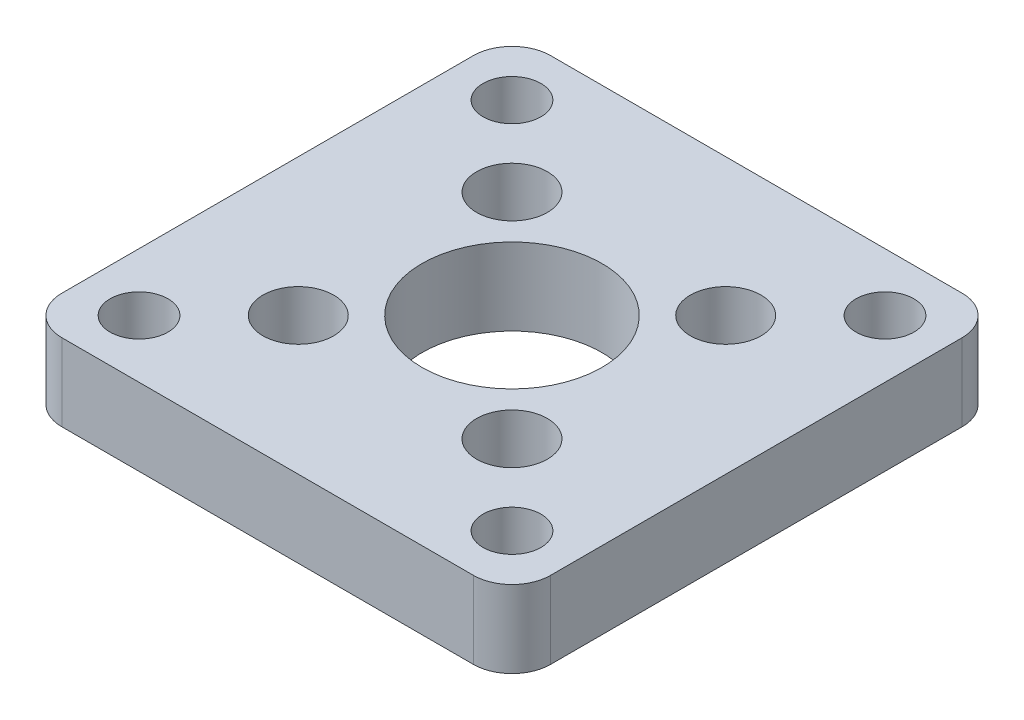
ISO-10303-21;
HEADER;
FILE_DESCRIPTION(('STEP AP214'),'2;1');
FILE_NAME('part.step','',(''),(''),'','','');
FILE_SCHEMA(('AUTOMOTIVE_DESIGN { 1 0 10303 214 1 1 1 1 }'));
ENDSEC;
DATA;
#1=APPLICATION_CONTEXT('core data for automotive mechanical design processes');
#2=APPLICATION_PROTOCOL_DEFINITION('international standard','automotive_design',2000,#1);
#3=PRODUCT_CONTEXT('',#1,'mechanical');
#4=PRODUCT('Part','Part','',(#3));
#5=PRODUCT_RELATED_PRODUCT_CATEGORY('part','',(#4));
#6=PRODUCT_DEFINITION_FORMATION('','',#4);
#7=PRODUCT_DEFINITION_CONTEXT('part definition',#1,'design');
#8=PRODUCT_DEFINITION('design','',#6,#7);
#9=PRODUCT_DEFINITION_SHAPE('','',#8);
#10=(LENGTH_UNIT() NAMED_UNIT(*) SI_UNIT(.MILLI.,.METRE.));
#11=(NAMED_UNIT(*) PLANE_ANGLE_UNIT() SI_UNIT($,.RADIAN.));
#12=(NAMED_UNIT(*) SI_UNIT($,.STERADIAN.) SOLID_ANGLE_UNIT());
#13=UNCERTAINTY_MEASURE_WITH_UNIT(LENGTH_MEASURE(1.E-05),#10,'distance_accuracy_value','');
#14=(GEOMETRIC_REPRESENTATION_CONTEXT(3) GLOBAL_UNCERTAINTY_ASSIGNED_CONTEXT((#13)) GLOBAL_UNIT_ASSIGNED_CONTEXT((#10,
#11,#12)) REPRESENTATION_CONTEXT('',''));
#15=CARTESIAN_POINT('',(0.,0.,0.));
#16=DIRECTION('',(0.,0.,1.));
#17=DIRECTION('',(1.,0.,0.));
#18=AXIS2_PLACEMENT_3D('',#15,#16,#17);
#19=CARTESIAN_POINT('',(-19.,3.,-19.));
#20=DIRECTION('',(1.,0.,0.));
#21=DIRECTION('',(0.,0.,-1.));
#22=AXIS2_PLACEMENT_3D('',#19,#20,#21);
#23=PLANE('',#22);
#24=DIRECTION('',(0.,0.,1.));
#25=VECTOR('',#24,1.);
#26=CARTESIAN_POINT('',(-19.,3.,-19.));
#27=LINE('',#26,#25);
#28=CARTESIAN_POINT('',(-19.,3.,-16.));
#29=VERTEX_POINT('',#28);
#30=CARTESIAN_POINT('',(-19.,3.,16.));
#31=VERTEX_POINT('',#30);
#32=EDGE_CURVE('E116',#29,#31,#27,.T.);
#33=ORIENTED_EDGE('',*,*,#32,.F.);
#34=DIRECTION('',(0.,-1.,0.));
#35=VECTOR('',#34,1.);
#36=CARTESIAN_POINT('',(-19.,3.,-16.));
#37=LINE('',#36,#35);
#38=CARTESIAN_POINT('',(-19.,-3.,-16.));
#39=VERTEX_POINT('',#38);
#40=EDGE_CURVE('E101',#29,#39,#37,.T.);
#41=ORIENTED_EDGE('',*,*,#40,.T.);
#42=DIRECTION('',(0.,0.,1.));
#43=VECTOR('',#42,1.);
#44=CARTESIAN_POINT('',(-19.,-3.,-19.));
#45=LINE('',#44,#43);
#46=CARTESIAN_POINT('',(-19.,-3.,16.));
#47=VERTEX_POINT('',#46);
#48=EDGE_CURVE('E113',#39,#47,#45,.T.);
#49=ORIENTED_EDGE('',*,*,#48,.T.);
#50=DIRECTION('',(0.,-1.,0.));
#51=VECTOR('',#50,1.);
#52=CARTESIAN_POINT('',(-19.,3.,16.));
#53=LINE('',#52,#51);
#54=EDGE_CURVE('E118',#47,#31,#53,.F.);
#55=ORIENTED_EDGE('',*,*,#54,.T.);
#56=EDGE_LOOP('',(#33,#41,#49,#55));
#57=FACE_BOUND('',#56,.T.);
#58=ADVANCED_FACE('F32',(#57),#23,.F.);
#59=CARTESIAN_POINT('',(-19.,3.,19.));
#60=DIRECTION('',(0.,0.,-1.));
#61=DIRECTION('',(-1.,0.,0.));
#62=AXIS2_PLACEMENT_3D('',#59,#60,#61);
#63=PLANE('',#62);
#64=DIRECTION('',(1.,0.,0.));
#65=VECTOR('',#64,1.);
#66=CARTESIAN_POINT('',(-19.,3.,19.));
#67=LINE('',#66,#65);
#68=CARTESIAN_POINT('',(-16.,3.,19.));
#69=VERTEX_POINT('',#68);
#70=CARTESIAN_POINT('',(16.,3.,19.));
#71=VERTEX_POINT('',#70);
#72=EDGE_CURVE('E171',#69,#71,#67,.T.);
#73=ORIENTED_EDGE('',*,*,#72,.F.);
#74=DIRECTION('',(0.,-1.,0.));
#75=VECTOR('',#74,1.);
#76=CARTESIAN_POINT('',(-16.,3.,19.));
#77=LINE('',#76,#75);
#78=CARTESIAN_POINT('',(-16.,-3.,19.));
#79=VERTEX_POINT('',#78);
#80=EDGE_CURVE('E155',#69,#79,#77,.T.);
#81=ORIENTED_EDGE('',*,*,#80,.T.);
#82=DIRECTION('',(1.,0.,0.));
#83=VECTOR('',#82,1.);
#84=CARTESIAN_POINT('',(-19.,-3.,19.));
#85=LINE('',#84,#83);
#86=CARTESIAN_POINT('',(16.,-3.,19.));
#87=VERTEX_POINT('',#86);
#88=EDGE_CURVE('E122',#79,#87,#85,.T.);
#89=ORIENTED_EDGE('',*,*,#88,.T.);
#90=DIRECTION('',(0.,-1.,0.));
#91=VECTOR('',#90,1.);
#92=CARTESIAN_POINT('',(16.,3.,19.));
#93=LINE('',#92,#91);
#94=EDGE_CURVE('E153',#87,#71,#93,.F.);
#95=ORIENTED_EDGE('',*,*,#94,.T.);
#96=EDGE_LOOP('',(#73,#81,#89,#95));
#97=FACE_BOUND('',#96,.T.);
#98=ADVANCED_FACE('F270',(#97),#63,.F.);
#99=CARTESIAN_POINT('',(19.,3.,-19.));
#100=DIRECTION('',(-1.,0.,0.));
#101=DIRECTION('',(0.,0.,1.));
#102=AXIS2_PLACEMENT_3D('',#99,#100,#101);
#103=PLANE('',#102);
#104=DIRECTION('',(0.,0.,-1.));
#105=VECTOR('',#104,1.);
#106=CARTESIAN_POINT('',(19.,-3.,-19.));
#107=LINE('',#106,#105);
#108=CARTESIAN_POINT('',(19.,-3.,16.));
#109=VERTEX_POINT('',#108);
#110=CARTESIAN_POINT('',(19.,-3.,-16.));
#111=VERTEX_POINT('',#110);
#112=EDGE_CURVE('E126',#109,#111,#107,.T.);
#113=ORIENTED_EDGE('',*,*,#112,.T.);
#114=DIRECTION('',(0.,-1.,0.));
#115=VECTOR('',#114,1.);
#116=CARTESIAN_POINT('',(19.,3.,-16.));
#117=LINE('',#116,#115);
#118=CARTESIAN_POINT('',(19.,3.,-16.));
#119=VERTEX_POINT('',#118);
#120=EDGE_CURVE('E11',#111,#119,#117,.F.);
#121=ORIENTED_EDGE('',*,*,#120,.T.);
#122=DIRECTION('',(0.,0.,-1.));
#123=VECTOR('',#122,1.);
#124=CARTESIAN_POINT('',(19.,3.,-19.));
#125=LINE('',#124,#123);
#126=CARTESIAN_POINT('',(19.,3.,16.));
#127=VERTEX_POINT('',#126);
#128=EDGE_CURVE('E161',#127,#119,#125,.T.);
#129=ORIENTED_EDGE('',*,*,#128,.F.);
#130=DIRECTION('',(0.,-1.,0.));
#131=VECTOR('',#130,1.);
#132=CARTESIAN_POINT('',(19.,3.,16.));
#133=LINE('',#132,#131);
#134=EDGE_CURVE('E40',#127,#109,#133,.T.);
#135=ORIENTED_EDGE('',*,*,#134,.T.);
#136=EDGE_LOOP('',(#113,#121,#129,#135));
#137=FACE_BOUND('',#136,.T.);
#138=ADVANCED_FACE('F160',(#137),#103,.F.);
#139=CARTESIAN_POINT('',(-19.,3.,-19.));
#140=DIRECTION('',(0.,0.,1.));
#141=DIRECTION('',(1.,0.,0.));
#142=AXIS2_PLACEMENT_3D('',#139,#140,#141);
#143=PLANE('',#142);
#144=DIRECTION('',(-1.,0.,0.));
#145=VECTOR('',#144,1.);
#146=CARTESIAN_POINT('',(-19.,-3.,-19.));
#147=LINE('',#146,#145);
#148=CARTESIAN_POINT('',(16.,-3.,-19.));
#149=VERTEX_POINT('',#148);
#150=CARTESIAN_POINT('',(-16.,-3.,-19.));
#151=VERTEX_POINT('',#150);
#152=EDGE_CURVE('E136',#149,#151,#147,.T.);
#153=ORIENTED_EDGE('',*,*,#152,.T.);
#154=DIRECTION('',(0.,-1.,0.));
#155=VECTOR('',#154,1.);
#156=CARTESIAN_POINT('',(-16.,3.,-19.));
#157=LINE('',#156,#155);
#158=CARTESIAN_POINT('',(-16.,3.,-19.));
#159=VERTEX_POINT('',#158);
#160=EDGE_CURVE('E102',#151,#159,#157,.F.);
#161=ORIENTED_EDGE('',*,*,#160,.T.);
#162=DIRECTION('',(-1.,0.,0.));
#163=VECTOR('',#162,1.);
#164=CARTESIAN_POINT('',(-19.,3.,-19.));
#165=LINE('',#164,#163);
#166=CARTESIAN_POINT('',(16.,3.,-19.));
#167=VERTEX_POINT('',#166);
#168=EDGE_CURVE('E132',#167,#159,#165,.T.);
#169=ORIENTED_EDGE('',*,*,#168,.F.);
#170=DIRECTION('',(0.,-1.,0.));
#171=VECTOR('',#170,1.);
#172=CARTESIAN_POINT('',(16.,3.,-19.));
#173=LINE('',#172,#171);
#174=EDGE_CURVE('E107',#167,#149,#173,.T.);
#175=ORIENTED_EDGE('',*,*,#174,.T.);
#176=EDGE_LOOP('',(#153,#161,#169,#175));
#177=FACE_BOUND('',#176,.T.);
#178=ADVANCED_FACE('F169',(#177),#143,.F.);
#179=CARTESIAN_POINT('',(-19.,3.,19.));
#180=DIRECTION('',(0.,1.,0.));
#181=DIRECTION('',(0.,0.,1.));
#182=AXIS2_PLACEMENT_3D('',#179,#180,#181);
#183=PLANE('',#182);
#184=CARTESIAN_POINT('',(0.,3.,0.));
#185=DIRECTION('',(0.,1.,0.));
#186=DIRECTION('',(0.,0.,1.));
#187=AXIS2_PLACEMENT_3D('',#184,#185,#186);
#188=CIRCLE('',#187,7.);
#189=CARTESIAN_POINT('',(0.,3.,7.));
#190=VERTEX_POINT('',#189);
#191=EDGE_CURVE('E220',#190,#190,#188,.T.);
#192=ORIENTED_EDGE('',*,*,#191,.F.);
#193=EDGE_LOOP('',(#192));
#194=FACE_BOUND('',#193,.T.);
#195=CARTESIAN_POINT('',(8.30850467894189,3.,-8.30850467894199));
#196=DIRECTION('',(0.,1.,0.));
#197=DIRECTION('',(0.,0.,-1.));
#198=AXIS2_PLACEMENT_3D('',#195,#196,#197);
#199=CIRCLE('',#198,2.75);
#200=CARTESIAN_POINT('',(8.30850467894189,3.,-11.058504678942));
#201=VERTEX_POINT('',#200);
#202=EDGE_CURVE('E214',#201,#201,#199,.T.);
#203=ORIENTED_EDGE('',*,*,#202,.F.);
#204=EDGE_LOOP('',(#203));
#205=FACE_BOUND('',#204,.T.);
#206=CARTESIAN_POINT('',(8.30850467894189,3.,8.30850467894198));
#207=DIRECTION('',(0.,1.,0.));
#208=DIRECTION('',(0.,0.,1.));
#209=AXIS2_PLACEMENT_3D('',#206,#207,#208);
#210=CIRCLE('',#209,2.75);
#211=CARTESIAN_POINT('',(8.30850467894189,3.,11.058504678942));
#212=VERTEX_POINT('',#211);
#213=EDGE_CURVE('E208',#212,#212,#210,.T.);
#214=ORIENTED_EDGE('',*,*,#213,.F.);
#215=EDGE_LOOP('',(#214));
#216=FACE_BOUND('',#215,.T.);
#217=CARTESIAN_POINT('',(-8.30850467894189,3.,8.30850467894198));
#218=DIRECTION('',(0.,1.,0.));
#219=DIRECTION('',(0.,0.,-1.));
#220=AXIS2_PLACEMENT_3D('',#217,#218,#219);
#221=CIRCLE('',#220,2.75);
#222=CARTESIAN_POINT('',(-8.30850467894189,3.,5.55850467894198));
#223=VERTEX_POINT('',#222);
#224=EDGE_CURVE('E202',#223,#223,#221,.T.);
#225=ORIENTED_EDGE('',*,*,#224,.F.);
#226=EDGE_LOOP('',(#225));
#227=FACE_BOUND('',#226,.T.);
#228=CARTESIAN_POINT('',(-8.30850467894189,3.,-8.30850467894198));
#229=DIRECTION('',(0.,1.,0.));
#230=DIRECTION('',(0.,0.,1.));
#231=AXIS2_PLACEMENT_3D('',#228,#229,#230);
#232=CIRCLE('',#231,2.75);
#233=CARTESIAN_POINT('',(-8.30850467894189,3.,-5.55850467894198));
#234=VERTEX_POINT('',#233);
#235=EDGE_CURVE('E196',#234,#234,#232,.T.);
#236=ORIENTED_EDGE('',*,*,#235,.F.);
#237=EDGE_LOOP('',(#236));
#238=FACE_BOUND('',#237,.T.);
#239=CARTESIAN_POINT('',(14.5,3.,-14.5));
#240=DIRECTION('',(0.,1.,0.));
#241=DIRECTION('',(0.,0.,-1.));
#242=AXIS2_PLACEMENT_3D('',#239,#240,#241);
#243=CIRCLE('',#242,2.25);
#244=CARTESIAN_POINT('',(14.5,3.,-16.75));
#245=VERTEX_POINT('',#244);
#246=EDGE_CURVE('E190',#245,#245,#243,.T.);
#247=ORIENTED_EDGE('',*,*,#246,.F.);
#248=EDGE_LOOP('',(#247));
#249=FACE_BOUND('',#248,.T.);
#250=CARTESIAN_POINT('',(14.5,3.,14.5));
#251=DIRECTION('',(0.,1.,0.));
#252=DIRECTION('',(0.,0.,1.));
#253=AXIS2_PLACEMENT_3D('',#250,#251,#252);
#254=CIRCLE('',#253,2.25);
#255=CARTESIAN_POINT('',(14.5,3.,16.75));
#256=VERTEX_POINT('',#255);
#257=EDGE_CURVE('E184',#256,#256,#254,.T.);
#258=ORIENTED_EDGE('',*,*,#257,.F.);
#259=EDGE_LOOP('',(#258));
#260=FACE_BOUND('',#259,.T.);
#261=CARTESIAN_POINT('',(-14.5,3.,14.5));
#262=DIRECTION('',(0.,1.,0.));
#263=DIRECTION('',(0.,0.,-1.));
#264=AXIS2_PLACEMENT_3D('',#261,#262,#263);
#265=CIRCLE('',#264,2.25);
#266=CARTESIAN_POINT('',(-14.5,3.,12.25));
#267=VERTEX_POINT('',#266);
#268=EDGE_CURVE('E178',#267,#267,#265,.T.);
#269=ORIENTED_EDGE('',*,*,#268,.F.);
#270=EDGE_LOOP('',(#269));
#271=FACE_BOUND('',#270,.T.);
#272=CARTESIAN_POINT('',(-14.5,3.,-14.5));
#273=DIRECTION('',(0.,1.,0.));
#274=DIRECTION('',(0.,0.,1.));
#275=AXIS2_PLACEMENT_3D('',#272,#273,#274);
#276=CIRCLE('',#275,2.25);
#277=CARTESIAN_POINT('',(-14.5,3.,-12.25));
#278=VERTEX_POINT('',#277);
#279=EDGE_CURVE('E129',#278,#278,#276,.T.);
#280=ORIENTED_EDGE('',*,*,#279,.F.);
#281=EDGE_LOOP('',(#280));
#282=FACE_BOUND('',#281,.T.);
#283=ORIENTED_EDGE('',*,*,#168,.T.);
#284=CARTESIAN_POINT('',(-16.,3.,-16.));
#285=DIRECTION('',(0.,1.,0.));
#286=DIRECTION('',(0.,0.,1.));
#287=AXIS2_PLACEMENT_3D('',#284,#285,#286);
#288=CIRCLE('',#287,3.);
#289=EDGE_CURVE('E151',#159,#29,#288,.T.);
#290=ORIENTED_EDGE('',*,*,#289,.T.);
#291=ORIENTED_EDGE('',*,*,#32,.T.);
#292=CARTESIAN_POINT('',(-16.,3.,16.));
#293=DIRECTION('',(0.,1.,0.));
#294=DIRECTION('',(0.,0.,1.));
#295=AXIS2_PLACEMENT_3D('',#292,#293,#294);
#296=CIRCLE('',#295,3.);
#297=EDGE_CURVE('E149',#31,#69,#296,.T.);
#298=ORIENTED_EDGE('',*,*,#297,.T.);
#299=ORIENTED_EDGE('',*,*,#72,.T.);
#300=CARTESIAN_POINT('',(16.,3.,16.));
#301=DIRECTION('',(0.,1.,0.));
#302=DIRECTION('',(0.,0.,1.));
#303=AXIS2_PLACEMENT_3D('',#300,#301,#302);
#304=CIRCLE('',#303,3.);
#305=EDGE_CURVE('E52',#71,#127,#304,.T.);
#306=ORIENTED_EDGE('',*,*,#305,.T.);
#307=ORIENTED_EDGE('',*,*,#128,.T.);
#308=CARTESIAN_POINT('',(16.,3.,-16.));
#309=DIRECTION('',(0.,1.,0.));
#310=DIRECTION('',(0.,0.,1.));
#311=AXIS2_PLACEMENT_3D('',#308,#309,#310);
#312=CIRCLE('',#311,3.);
#313=EDGE_CURVE('E147',#119,#167,#312,.T.);
#314=ORIENTED_EDGE('',*,*,#313,.T.);
#315=EDGE_LOOP('',(#283,#290,#291,#298,#299,#306,#307,#314));
#316=FACE_BOUND('',#315,.T.);
#317=ADVANCED_FACE('F235',(#194,#205,#216,#227,#238,#249,#260,#271,#282,#316),#183,.T.);
#318=CARTESIAN_POINT('',(-19.,-3.,19.));
#319=DIRECTION('',(0.,1.,0.));
#320=DIRECTION('',(0.,0.,1.));
#321=AXIS2_PLACEMENT_3D('',#318,#319,#320);
#322=PLANE('',#321);
#323=CARTESIAN_POINT('',(0.,-3.,0.));
#324=DIRECTION('',(0.,1.,0.));
#325=DIRECTION('',(0.,0.,1.));
#326=AXIS2_PLACEMENT_3D('',#323,#324,#325);
#327=CIRCLE('',#326,7.);
#328=CARTESIAN_POINT('',(0.,-3.,7.));
#329=VERTEX_POINT('',#328);
#330=EDGE_CURVE('E217',#329,#329,#327,.T.);
#331=ORIENTED_EDGE('',*,*,#330,.T.);
#332=EDGE_LOOP('',(#331));
#333=FACE_BOUND('',#332,.T.);
#334=CARTESIAN_POINT('',(8.30850467894189,-3.,-8.30850467894199));
#335=DIRECTION('',(0.,1.,0.));
#336=DIRECTION('',(0.,0.,-1.));
#337=AXIS2_PLACEMENT_3D('',#334,#335,#336);
#338=CIRCLE('',#337,2.75);
#339=CARTESIAN_POINT('',(8.30850467894189,-3.,-11.058504678942));
#340=VERTEX_POINT('',#339);
#341=EDGE_CURVE('E211',#340,#340,#338,.T.);
#342=ORIENTED_EDGE('',*,*,#341,.T.);
#343=EDGE_LOOP('',(#342));
#344=FACE_BOUND('',#343,.T.);
#345=CARTESIAN_POINT('',(8.30850467894189,-3.,8.30850467894198));
#346=DIRECTION('',(0.,1.,0.));
#347=DIRECTION('',(0.,0.,1.));
#348=AXIS2_PLACEMENT_3D('',#345,#346,#347);
#349=CIRCLE('',#348,2.75);
#350=CARTESIAN_POINT('',(8.30850467894189,-3.,11.058504678942));
#351=VERTEX_POINT('',#350);
#352=EDGE_CURVE('E205',#351,#351,#349,.T.);
#353=ORIENTED_EDGE('',*,*,#352,.T.);
#354=EDGE_LOOP('',(#353));
#355=FACE_BOUND('',#354,.T.);
#356=CARTESIAN_POINT('',(-8.30850467894189,-3.,8.30850467894198));
#357=DIRECTION('',(0.,1.,0.));
#358=DIRECTION('',(0.,0.,-1.));
#359=AXIS2_PLACEMENT_3D('',#356,#357,#358);
#360=CIRCLE('',#359,2.75);
#361=CARTESIAN_POINT('',(-8.30850467894189,-3.,5.55850467894198));
#362=VERTEX_POINT('',#361);
#363=EDGE_CURVE('E199',#362,#362,#360,.T.);
#364=ORIENTED_EDGE('',*,*,#363,.T.);
#365=EDGE_LOOP('',(#364));
#366=FACE_BOUND('',#365,.T.);
#367=CARTESIAN_POINT('',(-8.30850467894189,-3.,-8.30850467894198));
#368=DIRECTION('',(0.,1.,0.));
#369=DIRECTION('',(0.,0.,1.));
#370=AXIS2_PLACEMENT_3D('',#367,#368,#369);
#371=CIRCLE('',#370,2.75);
#372=CARTESIAN_POINT('',(-8.30850467894189,-3.,-5.55850467894198));
#373=VERTEX_POINT('',#372);
#374=EDGE_CURVE('E193',#373,#373,#371,.T.);
#375=ORIENTED_EDGE('',*,*,#374,.T.);
#376=EDGE_LOOP('',(#375));
#377=FACE_BOUND('',#376,.T.);
#378=CARTESIAN_POINT('',(14.5,-3.,-14.5));
#379=DIRECTION('',(0.,1.,0.));
#380=DIRECTION('',(0.,0.,-1.));
#381=AXIS2_PLACEMENT_3D('',#378,#379,#380);
#382=CIRCLE('',#381,2.25);
#383=CARTESIAN_POINT('',(14.5,-3.,-16.75));
#384=VERTEX_POINT('',#383);
#385=EDGE_CURVE('E187',#384,#384,#382,.T.);
#386=ORIENTED_EDGE('',*,*,#385,.T.);
#387=EDGE_LOOP('',(#386));
#388=FACE_BOUND('',#387,.T.);
#389=CARTESIAN_POINT('',(14.5,-3.,14.5));
#390=DIRECTION('',(0.,1.,0.));
#391=DIRECTION('',(0.,0.,1.));
#392=AXIS2_PLACEMENT_3D('',#389,#390,#391);
#393=CIRCLE('',#392,2.25);
#394=CARTESIAN_POINT('',(14.5,-3.,16.75));
#395=VERTEX_POINT('',#394);
#396=EDGE_CURVE('E181',#395,#395,#393,.T.);
#397=ORIENTED_EDGE('',*,*,#396,.T.);
#398=EDGE_LOOP('',(#397));
#399=FACE_BOUND('',#398,.T.);
#400=CARTESIAN_POINT('',(-14.5,-3.,14.5));
#401=DIRECTION('',(0.,1.,0.));
#402=DIRECTION('',(0.,0.,-1.));
#403=AXIS2_PLACEMENT_3D('',#400,#401,#402);
#404=CIRCLE('',#403,2.25);
#405=CARTESIAN_POINT('',(-14.5,-3.,12.25));
#406=VERTEX_POINT('',#405);
#407=EDGE_CURVE('E176',#406,#406,#404,.T.);
#408=ORIENTED_EDGE('',*,*,#407,.T.);
#409=EDGE_LOOP('',(#408));
#410=FACE_BOUND('',#409,.T.);
#411=CARTESIAN_POINT('',(-14.5,-3.,-14.5));
#412=DIRECTION('',(0.,1.,0.));
#413=DIRECTION('',(0.,0.,1.));
#414=AXIS2_PLACEMENT_3D('',#411,#412,#413);
#415=CIRCLE('',#414,2.25);
#416=CARTESIAN_POINT('',(-14.5,-3.,-12.25));
#417=VERTEX_POINT('',#416);
#418=EDGE_CURVE('E123',#417,#417,#415,.T.);
#419=ORIENTED_EDGE('',*,*,#418,.T.);
#420=EDGE_LOOP('',(#419));
#421=FACE_BOUND('',#420,.T.);
#422=ORIENTED_EDGE('',*,*,#48,.F.);
#423=CARTESIAN_POINT('',(-16.,-3.,-16.));
#424=DIRECTION('',(0.,1.,0.));
#425=DIRECTION('',(0.,0.,1.));
#426=AXIS2_PLACEMENT_3D('',#423,#424,#425);
#427=CIRCLE('',#426,3.);
#428=EDGE_CURVE('E97',#39,#151,#427,.F.);
#429=ORIENTED_EDGE('',*,*,#428,.T.);
#430=ORIENTED_EDGE('',*,*,#152,.F.);
#431=CARTESIAN_POINT('',(16.,-3.,-16.));
#432=DIRECTION('',(0.,1.,0.));
#433=DIRECTION('',(0.,0.,1.));
#434=AXIS2_PLACEMENT_3D('',#431,#432,#433);
#435=CIRCLE('',#434,3.);
#436=EDGE_CURVE('E140',#149,#111,#435,.F.);
#437=ORIENTED_EDGE('',*,*,#436,.T.);
#438=ORIENTED_EDGE('',*,*,#112,.F.);
#439=CARTESIAN_POINT('',(16.,-3.,16.));
#440=DIRECTION('',(0.,1.,0.));
#441=DIRECTION('',(0.,0.,1.));
#442=AXIS2_PLACEMENT_3D('',#439,#440,#441);
#443=CIRCLE('',#442,3.);
#444=EDGE_CURVE('E117',#109,#87,#443,.F.);
#445=ORIENTED_EDGE('',*,*,#444,.T.);
#446=ORIENTED_EDGE('',*,*,#88,.F.);
#447=CARTESIAN_POINT('',(-16.,-3.,16.));
#448=DIRECTION('',(0.,1.,0.));
#449=DIRECTION('',(0.,0.,1.));
#450=AXIS2_PLACEMENT_3D('',#447,#448,#449);
#451=CIRCLE('',#450,3.);
#452=EDGE_CURVE('E108',#79,#47,#451,.F.);
#453=ORIENTED_EDGE('',*,*,#452,.T.);
#454=EDGE_LOOP('',(#422,#429,#430,#437,#438,#445,#446,#453));
#455=FACE_BOUND('',#454,.T.);
#456=ADVANCED_FACE('F120',(#333,#344,#355,#366,#377,#388,#399,#410,#421,#455),#322,.F.);
#457=CARTESIAN_POINT('',(-14.5,-3.,-14.5));
#458=DIRECTION('',(0.,1.,0.));
#459=DIRECTION('',(0.,0.,1.));
#460=AXIS2_PLACEMENT_3D('',#457,#458,#459);
#461=CYLINDRICAL_SURFACE('',#460,2.25);
#462=ORIENTED_EDGE('',*,*,#418,.F.);
#463=EDGE_LOOP('',(#462));
#464=FACE_BOUND('',#463,.T.);
#465=ORIENTED_EDGE('',*,*,#279,.T.);
#466=EDGE_LOOP('',(#465));
#467=FACE_BOUND('',#466,.T.);
#468=ADVANCED_FACE('F255',(#464,#467),#461,.F.);
#469=CARTESIAN_POINT('',(-14.5,-3.,14.5));
#470=DIRECTION('',(0.,1.,0.));
#471=DIRECTION('',(0.,0.,1.));
#472=AXIS2_PLACEMENT_3D('',#469,#470,#471);
#473=CYLINDRICAL_SURFACE('',#472,2.25);
#474=ORIENTED_EDGE('',*,*,#407,.F.);
#475=EDGE_LOOP('',(#474));
#476=FACE_BOUND('',#475,.T.);
#477=ORIENTED_EDGE('',*,*,#268,.T.);
#478=EDGE_LOOP('',(#477));
#479=FACE_BOUND('',#478,.T.);
#480=ADVANCED_FACE('F257',(#476,#479),#473,.F.);
#481=CARTESIAN_POINT('',(14.5,-3.,14.5));
#482=DIRECTION('',(0.,1.,0.));
#483=DIRECTION('',(0.,0.,1.));
#484=AXIS2_PLACEMENT_3D('',#481,#482,#483);
#485=CYLINDRICAL_SURFACE('',#484,2.25);
#486=ORIENTED_EDGE('',*,*,#396,.F.);
#487=EDGE_LOOP('',(#486));
#488=FACE_BOUND('',#487,.T.);
#489=ORIENTED_EDGE('',*,*,#257,.T.);
#490=EDGE_LOOP('',(#489));
#491=FACE_BOUND('',#490,.T.);
#492=ADVANCED_FACE('F264',(#488,#491),#485,.F.);
#493=CARTESIAN_POINT('',(14.5,-3.,-14.5));
#494=DIRECTION('',(0.,1.,0.));
#495=DIRECTION('',(0.,0.,1.));
#496=AXIS2_PLACEMENT_3D('',#493,#494,#495);
#497=CYLINDRICAL_SURFACE('',#496,2.25);
#498=ORIENTED_EDGE('',*,*,#385,.F.);
#499=EDGE_LOOP('',(#498));
#500=FACE_BOUND('',#499,.T.);
#501=ORIENTED_EDGE('',*,*,#246,.T.);
#502=EDGE_LOOP('',(#501));
#503=FACE_BOUND('',#502,.T.);
#504=ADVANCED_FACE('F393',(#500,#503),#497,.F.);
#505=CARTESIAN_POINT('',(-8.30850467894189,-3.,-8.30850467894198));
#506=DIRECTION('',(0.,1.,0.));
#507=DIRECTION('',(0.,0.,1.));
#508=AXIS2_PLACEMENT_3D('',#505,#506,#507);
#509=CYLINDRICAL_SURFACE('',#508,2.75);
#510=ORIENTED_EDGE('',*,*,#374,.F.);
#511=EDGE_LOOP('',(#510));
#512=FACE_BOUND('',#511,.T.);
#513=ORIENTED_EDGE('',*,*,#235,.T.);
#514=EDGE_LOOP('',(#513));
#515=FACE_BOUND('',#514,.T.);
#516=ADVANCED_FACE('F383',(#512,#515),#509,.F.);
#517=CARTESIAN_POINT('',(-8.30850467894189,-3.,8.30850467894198));
#518=DIRECTION('',(0.,1.,0.));
#519=DIRECTION('',(0.,0.,1.));
#520=AXIS2_PLACEMENT_3D('',#517,#518,#519);
#521=CYLINDRICAL_SURFACE('',#520,2.75);
#522=ORIENTED_EDGE('',*,*,#363,.F.);
#523=EDGE_LOOP('',(#522));
#524=FACE_BOUND('',#523,.T.);
#525=ORIENTED_EDGE('',*,*,#224,.T.);
#526=EDGE_LOOP('',(#525));
#527=FACE_BOUND('',#526,.T.);
#528=ADVANCED_FACE('F373',(#524,#527),#521,.F.);
#529=CARTESIAN_POINT('',(8.30850467894189,-3.,8.30850467894198));
#530=DIRECTION('',(0.,1.,0.));
#531=DIRECTION('',(0.,0.,1.));
#532=AXIS2_PLACEMENT_3D('',#529,#530,#531);
#533=CYLINDRICAL_SURFACE('',#532,2.75);
#534=ORIENTED_EDGE('',*,*,#352,.F.);
#535=EDGE_LOOP('',(#534));
#536=FACE_BOUND('',#535,.T.);
#537=ORIENTED_EDGE('',*,*,#213,.T.);
#538=EDGE_LOOP('',(#537));
#539=FACE_BOUND('',#538,.T.);
#540=ADVANCED_FACE('F363',(#536,#539),#533,.F.);
#541=CARTESIAN_POINT('',(8.30850467894189,-3.,-8.30850467894199));
#542=DIRECTION('',(0.,1.,0.));
#543=DIRECTION('',(0.,0.,1.));
#544=AXIS2_PLACEMENT_3D('',#541,#542,#543);
#545=CYLINDRICAL_SURFACE('',#544,2.75);
#546=ORIENTED_EDGE('',*,*,#341,.F.);
#547=EDGE_LOOP('',(#546));
#548=FACE_BOUND('',#547,.T.);
#549=ORIENTED_EDGE('',*,*,#202,.T.);
#550=EDGE_LOOP('',(#549));
#551=FACE_BOUND('',#550,.T.);
#552=ADVANCED_FACE('F231',(#548,#551),#545,.F.);
#553=CARTESIAN_POINT('',(0.,-3.,0.));
#554=DIRECTION('',(0.,1.,0.));
#555=DIRECTION('',(0.,0.,1.));
#556=AXIS2_PLACEMENT_3D('',#553,#554,#555);
#557=CYLINDRICAL_SURFACE('',#556,7.);
#558=ORIENTED_EDGE('',*,*,#330,.F.);
#559=EDGE_LOOP('',(#558));
#560=FACE_BOUND('',#559,.T.);
#561=ORIENTED_EDGE('',*,*,#191,.T.);
#562=EDGE_LOOP('',(#561));
#563=FACE_BOUND('',#562,.T.);
#564=ADVANCED_FACE('F228',(#560,#563),#557,.F.);
#565=CARTESIAN_POINT('',(-16.,3.,-16.));
#566=DIRECTION('',(0.,-1.,0.));
#567=DIRECTION('',(0.,0.,-1.));
#568=AXIS2_PLACEMENT_3D('',#565,#566,#567);
#569=CYLINDRICAL_SURFACE('',#568,3.);
#570=ORIENTED_EDGE('',*,*,#289,.F.);
#571=ORIENTED_EDGE('',*,*,#160,.F.);
#572=ORIENTED_EDGE('',*,*,#428,.F.);
#573=ORIENTED_EDGE('',*,*,#40,.F.);
#574=EDGE_LOOP('',(#570,#571,#572,#573));
#575=FACE_BOUND('',#574,.T.);
#576=ADVANCED_FACE('F100',(#575),#569,.T.);
#577=CARTESIAN_POINT('',(-16.,3.,16.));
#578=DIRECTION('',(0.,-1.,0.));
#579=DIRECTION('',(0.,0.,-1.));
#580=AXIS2_PLACEMENT_3D('',#577,#578,#579);
#581=CYLINDRICAL_SURFACE('',#580,3.);
#582=ORIENTED_EDGE('',*,*,#297,.F.);
#583=ORIENTED_EDGE('',*,*,#54,.F.);
#584=ORIENTED_EDGE('',*,*,#452,.F.);
#585=ORIENTED_EDGE('',*,*,#80,.F.);
#586=EDGE_LOOP('',(#582,#583,#584,#585));
#587=FACE_BOUND('',#586,.T.);
#588=ADVANCED_FACE('F281',(#587),#581,.T.);
#589=CARTESIAN_POINT('',(16.,3.,-16.));
#590=DIRECTION('',(0.,-1.,0.));
#591=DIRECTION('',(0.,0.,-1.));
#592=AXIS2_PLACEMENT_3D('',#589,#590,#591);
#593=CYLINDRICAL_SURFACE('',#592,3.);
#594=ORIENTED_EDGE('',*,*,#313,.F.);
#595=ORIENTED_EDGE('',*,*,#120,.F.);
#596=ORIENTED_EDGE('',*,*,#436,.F.);
#597=ORIENTED_EDGE('',*,*,#174,.F.);
#598=EDGE_LOOP('',(#594,#595,#596,#597));
#599=FACE_BOUND('',#598,.T.);
#600=ADVANCED_FACE('F166',(#599),#593,.T.);
#601=CARTESIAN_POINT('',(16.,3.,16.));
#602=DIRECTION('',(0.,-1.,0.));
#603=DIRECTION('',(0.,0.,-1.));
#604=AXIS2_PLACEMENT_3D('',#601,#602,#603);
#605=CYLINDRICAL_SURFACE('',#604,3.);
#606=ORIENTED_EDGE('',*,*,#305,.F.);
#607=ORIENTED_EDGE('',*,*,#94,.F.);
#608=ORIENTED_EDGE('',*,*,#444,.F.);
#609=ORIENTED_EDGE('',*,*,#134,.F.);
#610=EDGE_LOOP('',(#606,#607,#608,#609));
#611=FACE_BOUND('',#610,.T.);
#612=ADVANCED_FACE('F34',(#611),#605,.T.);
#613=CLOSED_SHELL('',(#58,#98,#138,#178,#317,#456,#468,#480,#492,#504,#516,#528,#540,#552,#564,
#576,#588,#600,#612));
#614=MANIFOLD_SOLID_BREP('B2',#613);
#615=ADVANCED_BREP_SHAPE_REPRESENTATION('',(#18,#614),#14);
#616=SHAPE_DEFINITION_REPRESENTATION(#9,#615);
ENDSEC;
END-ISO-10303-21;
